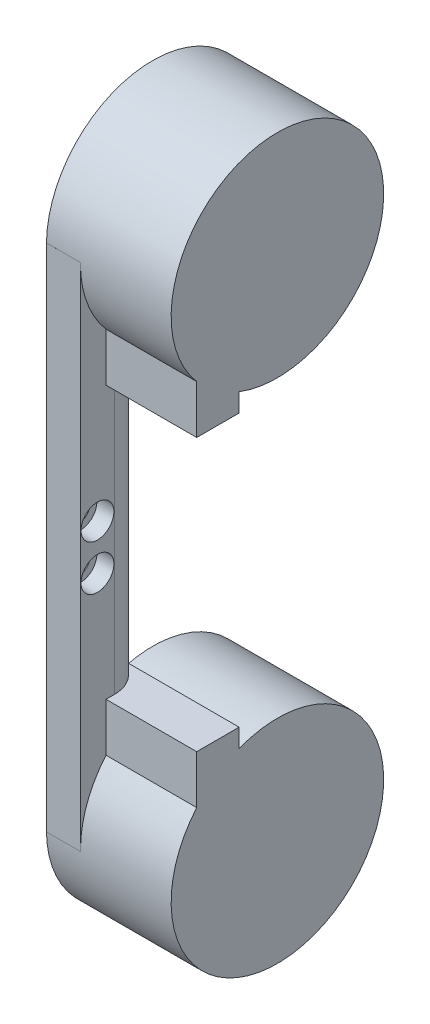
ISO-10303-21;
HEADER;
FILE_DESCRIPTION(('STEP AP214'),'2;1');
FILE_NAME('part.step','',(''),(''),'','','');
FILE_SCHEMA(('AUTOMOTIVE_DESIGN { 1 0 10303 214 1 1 1 1 }'));
ENDSEC;
DATA;
#1=APPLICATION_CONTEXT('core data for automotive mechanical design processes');
#2=APPLICATION_PROTOCOL_DEFINITION('international standard','automotive_design',2000,#1);
#3=PRODUCT_CONTEXT('',#1,'mechanical');
#4=PRODUCT('Part','Part','',(#3));
#5=PRODUCT_RELATED_PRODUCT_CATEGORY('part','',(#4));
#6=PRODUCT_DEFINITION_FORMATION('','',#4);
#7=PRODUCT_DEFINITION_CONTEXT('part definition',#1,'design');
#8=PRODUCT_DEFINITION('design','',#6,#7);
#9=PRODUCT_DEFINITION_SHAPE('','',#8);
#10=(LENGTH_UNIT() NAMED_UNIT(*) SI_UNIT(.MILLI.,.METRE.));
#11=(NAMED_UNIT(*) PLANE_ANGLE_UNIT() SI_UNIT($,.RADIAN.));
#12=(NAMED_UNIT(*) SI_UNIT($,.STERADIAN.) SOLID_ANGLE_UNIT());
#13=UNCERTAINTY_MEASURE_WITH_UNIT(LENGTH_MEASURE(1.E-05),#10,'distance_accuracy_value','');
#14=(GEOMETRIC_REPRESENTATION_CONTEXT(3) GLOBAL_UNCERTAINTY_ASSIGNED_CONTEXT((#13)) GLOBAL_UNIT_ASSIGNED_CONTEXT((#10,
#11,#12)) REPRESENTATION_CONTEXT('',''));
#15=CARTESIAN_POINT('',(0.,0.,0.));
#16=DIRECTION('',(0.,0.,1.));
#17=DIRECTION('',(1.,0.,0.));
#18=AXIS2_PLACEMENT_3D('',#15,#16,#17);
#19=CARTESIAN_POINT('',(0.,0.,0.));
#20=DIRECTION('',(1.,0.,0.));
#21=DIRECTION('',(0.,0.,-1.));
#22=AXIS2_PLACEMENT_3D('',#19,#20,#21);
#23=PLANE('',#22);
#24=CARTESIAN_POINT('',(0.,48.75,15.75));
#25=DIRECTION('',(1.,0.,0.));
#26=DIRECTION('',(0.,0.,1.));
#27=AXIS2_PLACEMENT_3D('',#24,#25,#26);
#28=CIRCLE('',#27,1.6);
#29=CARTESIAN_POINT('',(0.,48.75,17.35));
#30=VERTEX_POINT('',#29);
#31=EDGE_CURVE('E350',#30,#30,#28,.T.);
#32=ORIENTED_EDGE('',*,*,#31,.T.);
#33=EDGE_LOOP('',(#32));
#34=FACE_BOUND('',#33,.T.);
#35=CARTESIAN_POINT('',(0.,40.75,15.75));
#36=DIRECTION('',(-1.,0.,0.));
#37=DIRECTION('',(0.,0.,1.));
#38=AXIS2_PLACEMENT_3D('',#35,#36,#37);
#39=CIRCLE('',#38,1.6);
#40=CARTESIAN_POINT('',(0.,40.75,17.35));
#41=VERTEX_POINT('',#40);
#42=EDGE_CURVE('E471',#41,#41,#39,.T.);
#43=ORIENTED_EDGE('',*,*,#42,.F.);
#44=EDGE_LOOP('',(#43));
#45=FACE_BOUND('',#44,.T.);
#46=DIRECTION('',(0.,0.,-1.));
#47=VECTOR('',#46,1.);
#48=CARTESIAN_POINT('',(0.,49.75,10.25));
#49=LINE('',#48,#47);
#50=CARTESIAN_POINT('',(0.,49.75,7.74999999999999));
#51=VERTEX_POINT('',#50);
#52=CARTESIAN_POINT('',(0.,49.75,6.74999999999999));
#53=VERTEX_POINT('',#52);
#54=EDGE_CURVE('E260',#51,#53,#49,.T.);
#55=ORIENTED_EDGE('',*,*,#54,.F.);
#56=DIRECTION('',(0.,1.,0.));
#57=VECTOR('',#56,1.);
#58=CARTESIAN_POINT('',(0.,8.74999999999999,7.75));
#59=LINE('',#58,#57);
#60=CARTESIAN_POINT('',(0.,70.75,7.74999999999999));
#61=VERTEX_POINT('',#60);
#62=EDGE_CURVE('E463',#51,#61,#59,.T.);
#63=ORIENTED_EDGE('',*,*,#62,.T.);
#64=DIRECTION('',(0.,-1.,0.));
#65=VECTOR('',#64,1.);
#66=CARTESIAN_POINT('',(0.,89.5,7.74999999999998));
#67=LINE('',#66,#65);
#68=CARTESIAN_POINT('',(0.,72.4259459296644,7.74999999999998));
#69=VERTEX_POINT('',#68);
#70=EDGE_CURVE('E340',#69,#61,#67,.T.);
#71=ORIENTED_EDGE('',*,*,#70,.F.);
#72=DIRECTION('',(0.,-1.,0.));
#73=VECTOR('',#72,1.);
#74=CARTESIAN_POINT('',(0.,89.5,7.74999999999998));
#75=LINE('',#74,#73);
#76=CARTESIAN_POINT('',(0.,73.5312805773287,7.74999999999998));
#77=VERTEX_POINT('',#76);
#78=EDGE_CURVE('E346',#77,#69,#75,.T.);
#79=ORIENTED_EDGE('',*,*,#78,.F.);
#80=CARTESIAN_POINT('',(0.,89.5,0.));
#81=DIRECTION('',(-1.,0.,0.));
#82=DIRECTION('',(0.,0.,-1.));
#83=AXIS2_PLACEMENT_3D('',#80,#81,#82);
#84=CIRCLE('',#83,17.75);
#85=CARTESIAN_POINT('',(0.,77.1509109647716,12.75));
#86=VERTEX_POINT('',#85);
#87=EDGE_CURVE('E554',#86,#77,#84,.T.);
#88=ORIENTED_EDGE('',*,*,#87,.F.);
#89=DIRECTION('',(0.,-1.,0.));
#90=VECTOR('',#89,1.);
#91=CARTESIAN_POINT('',(0.,80.75,12.75));
#92=LINE('',#91,#90);
#93=CARTESIAN_POINT('',(0.,70.75,12.75));
#94=VERTEX_POINT('',#93);
#95=EDGE_CURVE('E335',#94,#86,#92,.F.);
#96=ORIENTED_EDGE('',*,*,#95,.F.);
#97=DIRECTION('',(0.,1.,0.));
#98=VECTOR('',#97,1.);
#99=CARTESIAN_POINT('',(0.,8.74999999999999,12.75));
#100=LINE('',#99,#98);
#101=CARTESIAN_POINT('',(0.,18.75,12.75));
#102=VERTEX_POINT('',#101);
#103=EDGE_CURVE('E465',#94,#102,#100,.F.);
#104=ORIENTED_EDGE('',*,*,#103,.T.);
#105=CARTESIAN_POINT('',(0.,12.3490890352285,12.75));
#106=VERTEX_POINT('',#105);
#107=EDGE_CURVE('E466',#102,#106,#100,.F.);
#108=ORIENTED_EDGE('',*,*,#107,.T.);
#109=CARTESIAN_POINT('',(0.,0.,0.));
#110=DIRECTION('',(1.,0.,0.));
#111=DIRECTION('',(0.,0.,-1.));
#112=AXIS2_PLACEMENT_3D('',#109,#110,#111);
#113=CIRCLE('',#112,17.75);
#114=CARTESIAN_POINT('',(0.,15.9687194226713,7.75));
#115=VERTEX_POINT('',#114);
#116=EDGE_CURVE('E632',#106,#115,#113,.T.);
#117=ORIENTED_EDGE('',*,*,#116,.T.);
#118=DIRECTION('',(0.,1.,0.));
#119=VECTOR('',#118,1.);
#120=CARTESIAN_POINT('',(0.,0.,7.75));
#121=LINE('',#120,#119);
#122=CARTESIAN_POINT('',(0.,17.0740540703356,7.75));
#123=VERTEX_POINT('',#122);
#124=EDGE_CURVE('E475',#115,#123,#121,.T.);
#125=ORIENTED_EDGE('',*,*,#124,.T.);
#126=DIRECTION('',(0.,1.,0.));
#127=VECTOR('',#126,1.);
#128=CARTESIAN_POINT('',(0.,0.,7.75));
#129=LINE('',#128,#127);
#130=CARTESIAN_POINT('',(0.,18.75,7.75));
#131=VERTEX_POINT('',#130);
#132=EDGE_CURVE('E516',#123,#131,#129,.T.);
#133=ORIENTED_EDGE('',*,*,#132,.T.);
#134=CARTESIAN_POINT('',(0.,39.75,7.74999999999999));
#135=VERTEX_POINT('',#134);
#136=EDGE_CURVE('E518',#131,#135,#59,.T.);
#137=ORIENTED_EDGE('',*,*,#136,.T.);
#138=DIRECTION('',(0.,0.,1.));
#139=VECTOR('',#138,1.);
#140=CARTESIAN_POINT('',(0.,39.75,10.25));
#141=LINE('',#140,#139);
#142=CARTESIAN_POINT('',(0.,39.75,6.74999999999999));
#143=VERTEX_POINT('',#142);
#144=EDGE_CURVE('E241',#143,#135,#141,.T.);
#145=ORIENTED_EDGE('',*,*,#144,.F.);
#146=DIRECTION('',(0.,1.,0.));
#147=VECTOR('',#146,1.);
#148=CARTESIAN_POINT('',(0.,-0.250000000000007,6.75));
#149=LINE('',#148,#147);
#150=CARTESIAN_POINT('',(0.,20.75,6.75));
#151=VERTEX_POINT('',#150);
#152=EDGE_CURVE('E497',#151,#143,#149,.T.);
#153=ORIENTED_EDGE('',*,*,#152,.F.);
#154=CARTESIAN_POINT('',(0.,17.4928556845359,6.75));
#155=VERTEX_POINT('',#154);
#156=EDGE_CURVE('E500',#155,#151,#149,.T.);
#157=ORIENTED_EDGE('',*,*,#156,.F.);
#158=CARTESIAN_POINT('',(0.,0.,0.));
#159=DIRECTION('',(1.,0.,0.));
#160=DIRECTION('',(0.,0.,-1.));
#161=AXIS2_PLACEMENT_3D('',#158,#159,#160);
#162=CIRCLE('',#161,18.75);
#163=CARTESIAN_POINT('',(0.,-0.250000000000002,18.7483332592527));
#164=VERTEX_POINT('',#163);
#165=EDGE_CURVE('E633',#164,#155,#162,.T.);
#166=ORIENTED_EDGE('',*,*,#165,.F.);
#167=DIRECTION('',(0.,0.,1.));
#168=VECTOR('',#167,1.);
#169=CARTESIAN_POINT('',(0.,-0.250000000000004,18.75));
#170=LINE('',#169,#168);
#171=CARTESIAN_POINT('',(0.,-0.250000000000004,18.75));
#172=VERTEX_POINT('',#171);
#173=EDGE_CURVE('E477',#164,#172,#170,.T.);
#174=ORIENTED_EDGE('',*,*,#173,.T.);
#175=DIRECTION('',(0.,1.,0.));
#176=VECTOR('',#175,1.);
#177=CARTESIAN_POINT('',(0.,-0.250000000000004,18.75));
#178=LINE('',#177,#176);
#179=CARTESIAN_POINT('',(0.,89.75,18.75));
#180=VERTEX_POINT('',#179);
#181=EDGE_CURVE('E494',#172,#180,#178,.T.);
#182=ORIENTED_EDGE('',*,*,#181,.T.);
#183=DIRECTION('',(0.,0.,1.));
#184=VECTOR('',#183,1.);
#185=CARTESIAN_POINT('',(0.,89.75,18.75));
#186=LINE('',#185,#184);
#187=CARTESIAN_POINT('',(0.,89.75,18.7483332592527));
#188=VERTEX_POINT('',#187);
#189=EDGE_CURVE('E349',#188,#180,#186,.T.);
#190=ORIENTED_EDGE('',*,*,#189,.F.);
#191=CARTESIAN_POINT('',(0.,89.5,0.));
#192=DIRECTION('',(-1.,0.,0.));
#193=DIRECTION('',(0.,0.,-1.));
#194=AXIS2_PLACEMENT_3D('',#191,#192,#193);
#195=CIRCLE('',#194,18.75);
#196=CARTESIAN_POINT('',(0.,72.0071443154641,6.74999999999999));
#197=VERTEX_POINT('',#196);
#198=EDGE_CURVE('E549',#188,#197,#195,.T.);
#199=ORIENTED_EDGE('',*,*,#198,.T.);
#200=DIRECTION('',(0.,-1.,0.));
#201=VECTOR('',#200,1.);
#202=CARTESIAN_POINT('',(0.,89.75,6.74999999999998));
#203=LINE('',#202,#201);
#204=CARTESIAN_POINT('',(0.,68.75,6.74999999999999));
#205=VERTEX_POINT('',#204);
#206=EDGE_CURVE('E359',#197,#205,#203,.T.);
#207=ORIENTED_EDGE('',*,*,#206,.T.);
#208=EDGE_CURVE('E490',#53,#205,#149,.T.);
#209=ORIENTED_EDGE('',*,*,#208,.F.);
#210=EDGE_LOOP('',(#55,#63,#71,#79,#88,#96,#104,#108,#117,#125,#133,#137,#145,#153,#157,#166,
#174,#182,#190,#199,#207,#209));
#211=FACE_BOUND('',#210,.T.);
#212=ADVANCED_FACE('F39',(#34,#45,#211),#23,.F.);
#213=CARTESIAN_POINT('',(0.,10.75,12.75));
#214=DIRECTION('',(0.,0.,1.));
#215=DIRECTION('',(0.,-1.,0.));
#216=AXIS2_PLACEMENT_3D('',#213,#214,#215);
#217=PLANE('',#216);
#218=DIRECTION('',(1.,0.,0.));
#219=VECTOR('',#218,1.);
#220=CARTESIAN_POINT('',(0.,18.75,12.75));
#221=LINE('',#220,#219);
#222=CARTESIAN_POINT('',(20.,18.75,12.75));
#223=VERTEX_POINT('',#222);
#224=EDGE_CURVE('E411',#102,#223,#221,.T.);
#225=ORIENTED_EDGE('',*,*,#224,.T.);
#226=DIRECTION('',(0.,1.,0.));
#227=VECTOR('',#226,1.);
#228=CARTESIAN_POINT('',(20.,10.75,12.75));
#229=LINE('',#228,#227);
#230=CARTESIAN_POINT('',(20.,12.3490890352285,12.75));
#231=VERTEX_POINT('',#230);
#232=EDGE_CURVE('E451',#231,#223,#229,.T.);
#233=ORIENTED_EDGE('',*,*,#232,.F.);
#234=DIRECTION('',(-1.,0.,0.));
#235=VECTOR('',#234,1.);
#236=CARTESIAN_POINT('',(20.,12.3490890352285,12.75));
#237=LINE('',#236,#235);
#238=EDGE_CURVE('E456',#231,#106,#237,.T.);
#239=ORIENTED_EDGE('',*,*,#238,.T.);
#240=ORIENTED_EDGE('',*,*,#107,.F.);
#241=EDGE_LOOP('',(#225,#233,#239,#240));
#242=FACE_BOUND('',#241,.T.);
#243=ADVANCED_FACE('F658',(#242),#217,.F.);
#244=CARTESIAN_POINT('',(0.,18.75,0.));
#245=DIRECTION('',(0.,-1.,0.));
#246=DIRECTION('',(0.,0.,-1.));
#247=AXIS2_PLACEMENT_3D('',#244,#245,#246);
#248=PLANE('',#247);
#249=DIRECTION('',(1.,0.,0.));
#250=VECTOR('',#249,1.);
#251=CARTESIAN_POINT('',(0.,18.75,7.75));
#252=LINE('',#251,#250);
#253=CARTESIAN_POINT('',(3.3166247903554,18.75,7.75));
#254=VERTEX_POINT('',#253);
#255=CARTESIAN_POINT('',(20.,18.75,7.75));
#256=VERTEX_POINT('',#255);
#257=EDGE_CURVE('E401',#254,#256,#252,.T.);
#258=ORIENTED_EDGE('',*,*,#257,.T.);
#259=DIRECTION('',(0.,0.,1.));
#260=VECTOR('',#259,1.);
#261=CARTESIAN_POINT('',(20.,18.75,0.));
#262=LINE('',#261,#260);
#263=EDGE_CURVE('E62',#256,#223,#262,.T.);
#264=ORIENTED_EDGE('',*,*,#263,.T.);
#265=ORIENTED_EDGE('',*,*,#224,.F.);
#266=CARTESIAN_POINT('',(0.,18.75,10.25));
#267=DIRECTION('',(0.,-1.,0.));
#268=DIRECTION('',(0.,0.,-1.));
#269=AXIS2_PLACEMENT_3D('',#266,#267,#268);
#270=CIRCLE('',#269,2.5);
#271=EDGE_CURVE('E627',#102,#131,#270,.F.);
#272=ORIENTED_EDGE('',*,*,#271,.T.);
#273=DIRECTION('',(-1.,0.,0.));
#274=VECTOR('',#273,1.);
#275=CARTESIAN_POINT('',(0.,18.75,7.75));
#276=LINE('',#275,#274);
#277=EDGE_CURVE('E455',#254,#131,#276,.T.);
#278=ORIENTED_EDGE('',*,*,#277,.F.);
#279=EDGE_LOOP('',(#258,#264,#265,#272,#278));
#280=FACE_BOUND('',#279,.T.);
#281=ADVANCED_FACE('F431',(#280),#248,.T.);
#282=CARTESIAN_POINT('',(0.,17.0747370752051,7.74698998402707));
#283=DIRECTION('',(0.,-0.00179673952654987,0.999998385862234));
#284=DIRECTION('',(0.,-0.999998385862234,-0.00179673952654987));
#285=AXIS2_PLACEMENT_3D('',#282,#283,#284);
#286=PLANE('',#285);
#287=CARTESIAN_POINT('',(3.31435366731395,17.0747370752051,7.74698998402707));
#288=DIRECTION('',(1.,0.,0.));
#289=VECTOR('',#288,1.);
#290=LINE('',#287,#289);
#291=CARTESIAN_POINT('',(3.31470459409763,17.0745260057656,7.74745508222076));
#292=VERTEX_POINT('',#291);
#293=CARTESIAN_POINT('',(20.,17.0738840041313,7.74849468643625));
#294=VERTEX_POINT('',#293);
#295=EDGE_CURVE('E636',#292,#294,#290,.T.);
#296=ORIENTED_EDGE('',*,*,#295,.T.);
#297=DIRECTION('',(0.,0.999998385862234,0.00179673952654987));
#298=VECTOR('',#297,1.);
#299=CARTESIAN_POINT('',(20.,17.0747370752051,7.74698998402707));
#300=LINE('',#299,#298);
#301=EDGE_CURVE('E525',#294,#256,#300,.T.);
#302=ORIENTED_EDGE('',*,*,#301,.T.);
#303=ORIENTED_EDGE('',*,*,#257,.F.);
#304=CARTESIAN_POINT('',(3.3166247903554,17.0733710789639,7.75));
#305=DIRECTION('',(0.,1.,0.));
#306=VECTOR('',#305,1.);
#307=LINE('',#304,#306);
#308=EDGE_CURVE('E462',#292,#254,#307,.T.);
#309=ORIENTED_EDGE('',*,*,#308,.F.);
#310=EDGE_LOOP('',(#296,#302,#303,#309));
#311=FACE_BOUND('',#310,.T.);
#312=ADVANCED_FACE('F423',(#311),#286,.T.);
#313=CARTESIAN_POINT('',(6.,-0.250000000000004,12.75));
#314=DIRECTION('',(1.,0.,0.));
#315=DIRECTION('',(0.,0.,-1.));
#316=AXIS2_PLACEMENT_3D('',#313,#314,#315);
#317=PLANE('',#316);
#318=CARTESIAN_POINT('',(6.,40.75,15.75));
#319=DIRECTION('',(1.,0.,0.));
#320=DIRECTION('',(0.,0.,-1.));
#321=AXIS2_PLACEMENT_3D('',#318,#319,#320);
#322=CIRCLE('',#321,2.9);
#323=CARTESIAN_POINT('',(6.,40.75,12.85));
#324=VERTEX_POINT('',#323);
#325=EDGE_CURVE('E473',#324,#324,#322,.T.);
#326=ORIENTED_EDGE('',*,*,#325,.F.);
#327=EDGE_LOOP('',(#326));
#328=FACE_BOUND('',#327,.T.);
#329=DIRECTION('',(0.,-1.,0.));
#330=VECTOR('',#329,1.);
#331=CARTESIAN_POINT('',(6.,-0.250000000000004,14.2370280871371));
#332=LINE('',#331,#330);
#333=CARTESIAN_POINT('',(6.,20.75,14.2370280871371));
#334=VERTEX_POINT('',#333);
#335=CARTESIAN_POINT('',(6.,12.2012102369425,14.2370280871371));
#336=VERTEX_POINT('',#335);
#337=EDGE_CURVE('E511',#334,#336,#332,.T.);
#338=ORIENTED_EDGE('',*,*,#337,.F.);
#339=DIRECTION('',(0.,0.,1.));
#340=VECTOR('',#339,1.);
#341=CARTESIAN_POINT('',(6.,20.75,12.75));
#342=LINE('',#341,#340);
#343=CARTESIAN_POINT('',(6.,20.75,12.75));
#344=VERTEX_POINT('',#343);
#345=EDGE_CURVE('E523',#344,#334,#342,.T.);
#346=ORIENTED_EDGE('',*,*,#345,.F.);
#347=DIRECTION('',(0.,1.,0.));
#348=VECTOR('',#347,1.);
#349=CARTESIAN_POINT('',(6.,-0.250000000000004,12.75));
#350=LINE('',#349,#348);
#351=CARTESIAN_POINT('',(6.,68.75,12.75));
#352=VERTEX_POINT('',#351);
#353=EDGE_CURVE('E486',#344,#352,#350,.T.);
#354=ORIENTED_EDGE('',*,*,#353,.T.);
#355=DIRECTION('',(0.,0.,1.));
#356=VECTOR('',#355,1.);
#357=CARTESIAN_POINT('',(6.,68.75,12.75));
#358=LINE('',#357,#356);
#359=CARTESIAN_POINT('',(6.,68.75,14.2370280871371));
#360=VERTEX_POINT('',#359);
#361=EDGE_CURVE('E383',#352,#360,#358,.T.);
#362=ORIENTED_EDGE('',*,*,#361,.T.);
#363=DIRECTION('',(0.,1.,0.));
#364=VECTOR('',#363,1.);
#365=CARTESIAN_POINT('',(6.,89.75,14.2370280871371));
#366=LINE('',#365,#364);
#367=CARTESIAN_POINT('',(6.,77.2987897630575,14.2370280871371));
#368=VERTEX_POINT('',#367);
#369=EDGE_CURVE('E376',#360,#368,#366,.T.);
#370=ORIENTED_EDGE('',*,*,#369,.T.);
#371=CARTESIAN_POINT('',(6.,89.5,0.));
#372=DIRECTION('',(-1.,0.,0.));
#373=DIRECTION('',(0.,0.,-1.));
#374=AXIS2_PLACEMENT_3D('',#371,#372,#373);
#375=CIRCLE('',#374,18.75);
#376=CARTESIAN_POINT('',(6.,89.5,18.75));
#377=VERTEX_POINT('',#376);
#378=EDGE_CURVE('E369',#368,#377,#375,.T.);
#379=ORIENTED_EDGE('',*,*,#378,.T.);
#380=DIRECTION('',(0.,1.,0.));
#381=VECTOR('',#380,1.);
#382=CARTESIAN_POINT('',(6.,-0.250000000000004,18.75));
#383=LINE('',#382,#381);
#384=CARTESIAN_POINT('',(6.,0.,18.75));
#385=VERTEX_POINT('',#384);
#386=EDGE_CURVE('E492',#385,#377,#383,.T.);
#387=ORIENTED_EDGE('',*,*,#386,.F.);
#388=CARTESIAN_POINT('',(6.,0.,0.));
#389=DIRECTION('',(1.,0.,0.));
#390=DIRECTION('',(0.,0.,-1.));
#391=AXIS2_PLACEMENT_3D('',#388,#389,#390);
#392=CIRCLE('',#391,18.75);
#393=EDGE_CURVE('E503',#336,#385,#392,.T.);
#394=ORIENTED_EDGE('',*,*,#393,.F.);
#395=EDGE_LOOP('',(#338,#346,#354,#362,#370,#379,#387,#394));
#396=FACE_BOUND('',#395,.T.);
#397=CARTESIAN_POINT('',(6.,48.75,15.75));
#398=DIRECTION('',(-1.,0.,0.));
#399=DIRECTION('',(0.,0.,-1.));
#400=AXIS2_PLACEMENT_3D('',#397,#398,#399);
#401=CIRCLE('',#400,2.9);
#402=CARTESIAN_POINT('',(6.,48.75,12.85));
#403=VERTEX_POINT('',#402);
#404=EDGE_CURVE('E343',#403,#403,#401,.T.);
#405=ORIENTED_EDGE('',*,*,#404,.T.);
#406=EDGE_LOOP('',(#405));
#407=FACE_BOUND('',#406,.T.);
#408=ADVANCED_FACE('F434',(#328,#396,#407),#317,.T.);
#409=CARTESIAN_POINT('',(20.,0.,0.));
#410=DIRECTION('',(-1.,0.,0.));
#411=DIRECTION('',(0.,0.,1.));
#412=AXIS2_PLACEMENT_3D('',#409,#410,#411);
#413=CYLINDRICAL_SURFACE('',#412,18.75);
#414=DIRECTION('',(1.,0.,0.));
#415=VECTOR('',#414,1.);
#416=CARTESIAN_POINT('',(0.,12.2012102369425,14.2370280871371));
#417=LINE('',#416,#415);
#418=CARTESIAN_POINT('',(22.,12.2012102369425,14.2370280871371));
#419=VERTEX_POINT('',#418);
#420=EDGE_CURVE('E410',#336,#419,#417,.T.);
#421=ORIENTED_EDGE('',*,*,#420,.F.);
#422=ORIENTED_EDGE('',*,*,#393,.T.);
#423=CARTESIAN_POINT('',(6.,-0.250000000000004,18.7483332592527));
#424=VERTEX_POINT('',#423);
#425=EDGE_CURVE('E505',#385,#424,#392,.T.);
#426=ORIENTED_EDGE('',*,*,#425,.T.);
#427=DIRECTION('',(-1.,0.,0.));
#428=VECTOR('',#427,1.);
#429=CARTESIAN_POINT('',(20.,-0.250000000000002,18.7483332592527));
#430=LINE('',#429,#428);
#431=EDGE_CURVE('E487',#164,#424,#430,.F.);
#432=ORIENTED_EDGE('',*,*,#431,.F.);
#433=ORIENTED_EDGE('',*,*,#165,.T.);
#434=DIRECTION('',(1.,0.,0.));
#435=VECTOR('',#434,1.);
#436=CARTESIAN_POINT('',(0.,17.4928556845359,6.75));
#437=LINE('',#436,#435);
#438=CARTESIAN_POINT('',(22.,17.4928556845359,6.75));
#439=VERTEX_POINT('',#438);
#440=EDGE_CURVE('E414',#155,#439,#437,.T.);
#441=ORIENTED_EDGE('',*,*,#440,.T.);
#442=CARTESIAN_POINT('',(22.,0.,0.));
#443=DIRECTION('',(1.,0.,0.));
#444=DIRECTION('',(0.,0.,-1.));
#445=AXIS2_PLACEMENT_3D('',#442,#443,#444);
#446=CIRCLE('',#445,18.75);
#447=EDGE_CURVE('E508',#419,#439,#446,.T.);
#448=ORIENTED_EDGE('',*,*,#447,.F.);
#449=EDGE_LOOP('',(#421,#422,#426,#432,#433,#441,#448));
#450=FACE_BOUND('',#449,.T.);
#451=ADVANCED_FACE('F41',(#450),#413,.T.);
#452=CARTESIAN_POINT('',(0.,8.74999999999999,10.25));
#453=DIRECTION('',(0.,1.,0.));
#454=DIRECTION('',(0.,0.,1.));
#455=AXIS2_PLACEMENT_3D('',#452,#453,#454);
#456=CYLINDRICAL_SURFACE('',#455,2.5);
#457=ORIENTED_EDGE('',*,*,#62,.F.);
#458=CARTESIAN_POINT('',(0.,49.75,10.25));
#459=DIRECTION('',(0.,1.,0.));
#460=DIRECTION('',(0.,0.,1.));
#461=AXIS2_PLACEMENT_3D('',#458,#459,#460);
#462=CIRCLE('',#461,2.5);
#463=CARTESIAN_POINT('',(2.5,49.75,10.25));
#464=VERTEX_POINT('',#463);
#465=EDGE_CURVE('E248',#51,#464,#462,.F.);
#466=ORIENTED_EDGE('',*,*,#465,.T.);
#467=DIRECTION('',(0.,1.,0.));
#468=VECTOR('',#467,1.);
#469=CARTESIAN_POINT('',(2.5,49.75,10.25));
#470=LINE('',#469,#468);
#471=CARTESIAN_POINT('',(2.5,39.75,10.25));
#472=VERTEX_POINT('',#471);
#473=EDGE_CURVE('E249',#472,#464,#470,.T.);
#474=ORIENTED_EDGE('',*,*,#473,.F.);
#475=CARTESIAN_POINT('',(0.,39.75,10.25));
#476=DIRECTION('',(0.,-1.,0.));
#477=DIRECTION('',(0.,0.,-1.));
#478=AXIS2_PLACEMENT_3D('',#475,#476,#477);
#479=CIRCLE('',#478,2.5);
#480=EDGE_CURVE('E233',#472,#135,#479,.F.);
#481=ORIENTED_EDGE('',*,*,#480,.T.);
#482=ORIENTED_EDGE('',*,*,#136,.F.);
#483=ORIENTED_EDGE('',*,*,#271,.F.);
#484=ORIENTED_EDGE('',*,*,#103,.F.);
#485=CARTESIAN_POINT('',(0.,70.75,10.25));
#486=DIRECTION('',(0.,-1.,0.));
#487=DIRECTION('',(0.,0.,-1.));
#488=AXIS2_PLACEMENT_3D('',#485,#486,#487);
#489=CIRCLE('',#488,2.5);
#490=EDGE_CURVE('E553',#94,#61,#489,.F.);
#491=ORIENTED_EDGE('',*,*,#490,.T.);
#492=EDGE_LOOP('',(#457,#466,#474,#481,#482,#483,#484,#491));
#493=FACE_BOUND('',#492,.T.);
#494=ADVANCED_FACE('F251',(#493),#456,.F.);
#495=CARTESIAN_POINT('',(22.,40.75,15.75));
#496=DIRECTION('',(-1.,0.,0.));
#497=DIRECTION('',(0.,0.,1.));
#498=AXIS2_PLACEMENT_3D('',#495,#496,#497);
#499=CYLINDRICAL_SURFACE('',#498,1.6);
#500=ORIENTED_EDGE('',*,*,#42,.T.);
#501=EDGE_LOOP('',(#500));
#502=FACE_BOUND('',#501,.T.);
#503=CARTESIAN_POINT('',(3.,40.75,15.75));
#504=DIRECTION('',(1.,0.,0.));
#505=DIRECTION('',(0.,0.,-1.));
#506=AXIS2_PLACEMENT_3D('',#503,#504,#505);
#507=CIRCLE('',#506,1.6);
#508=CARTESIAN_POINT('',(3.,40.75,14.15));
#509=VERTEX_POINT('',#508);
#510=EDGE_CURVE('E469',#509,#509,#507,.F.);
#511=ORIENTED_EDGE('',*,*,#510,.F.);
#512=EDGE_LOOP('',(#511));
#513=FACE_BOUND('',#512,.T.);
#514=ADVANCED_FACE('F703',(#502,#513),#499,.F.);
#515=CARTESIAN_POINT('',(20.,0.,0.));
#516=DIRECTION('',(-1.,0.,0.));
#517=DIRECTION('',(0.,0.,1.));
#518=AXIS2_PLACEMENT_3D('',#515,#516,#517);
#519=CYLINDRICAL_SURFACE('',#518,17.75);
#520=DIRECTION('',(-1.,0.,0.));
#521=VECTOR('',#520,1.);
#522=CARTESIAN_POINT('',(20.,15.9687194226713,7.75));
#523=LINE('',#522,#521);
#524=CARTESIAN_POINT('',(20.,15.9687194226713,7.75));
#525=VERTEX_POINT('',#524);
#526=EDGE_CURVE('E634',#115,#525,#523,.F.);
#527=ORIENTED_EDGE('',*,*,#526,.F.);
#528=ORIENTED_EDGE('',*,*,#116,.F.);
#529=ORIENTED_EDGE('',*,*,#238,.F.);
#530=CARTESIAN_POINT('',(20.,0.,0.));
#531=DIRECTION('',(1.,0.,0.));
#532=DIRECTION('',(0.,0.,-1.));
#533=AXIS2_PLACEMENT_3D('',#530,#531,#532);
#534=CIRCLE('',#533,17.75);
#535=EDGE_CURVE('E510',#231,#525,#534,.T.);
#536=ORIENTED_EDGE('',*,*,#535,.T.);
#537=EDGE_LOOP('',(#527,#528,#529,#536));
#538=FACE_BOUND('',#537,.T.);
#539=ADVANCED_FACE('F686',(#538),#519,.F.);
#540=CARTESIAN_POINT('',(20.,0.,0.));
#541=DIRECTION('',(1.,0.,0.));
#542=DIRECTION('',(0.,0.,-1.));
#543=AXIS2_PLACEMENT_3D('',#540,#541,#542);
#544=PLANE('',#543);
#545=ORIENTED_EDGE('',*,*,#232,.T.);
#546=ORIENTED_EDGE('',*,*,#263,.F.);
#547=ORIENTED_EDGE('',*,*,#301,.F.);
#548=DIRECTION('',(0.,1.,0.));
#549=VECTOR('',#548,1.);
#550=CARTESIAN_POINT('',(20.,10.75,7.75));
#551=LINE('',#550,#549);
#552=EDGE_CURVE('E460',#525,#294,#551,.T.);
#553=ORIENTED_EDGE('',*,*,#552,.F.);
#554=ORIENTED_EDGE('',*,*,#535,.F.);
#555=EDGE_LOOP('',(#545,#546,#547,#553,#554));
#556=FACE_BOUND('',#555,.T.);
#557=ADVANCED_FACE('F688',(#556),#544,.F.);
#558=CARTESIAN_POINT('',(22.,0.,0.));
#559=DIRECTION('',(1.,0.,0.));
#560=DIRECTION('',(0.,0.,-1.));
#561=AXIS2_PLACEMENT_3D('',#558,#559,#560);
#562=PLANE('',#561);
#563=ORIENTED_EDGE('',*,*,#447,.T.);
#564=DIRECTION('',(0.,1.,0.));
#565=VECTOR('',#564,1.);
#566=CARTESIAN_POINT('',(22.,17.4928556845359,6.75));
#567=LINE('',#566,#565);
#568=CARTESIAN_POINT('',(22.,20.75,6.74999999999999));
#569=VERTEX_POINT('',#568);
#570=EDGE_CURVE('E409',#439,#569,#567,.T.);
#571=ORIENTED_EDGE('',*,*,#570,.T.);
#572=DIRECTION('',(0.,0.,-1.));
#573=VECTOR('',#572,1.);
#574=CARTESIAN_POINT('',(22.,20.75,14.2370280871371));
#575=LINE('',#574,#573);
#576=CARTESIAN_POINT('',(22.,20.75,14.2370280871371));
#577=VERTEX_POINT('',#576);
#578=EDGE_CURVE('E393',#577,#569,#575,.T.);
#579=ORIENTED_EDGE('',*,*,#578,.F.);
#580=DIRECTION('',(0.,-1.,0.));
#581=VECTOR('',#580,1.);
#582=CARTESIAN_POINT('',(22.,12.2012102369425,14.2370280871371));
#583=LINE('',#582,#581);
#584=EDGE_CURVE('E408',#577,#419,#583,.T.);
#585=ORIENTED_EDGE('',*,*,#584,.T.);
#586=EDGE_LOOP('',(#563,#571,#579,#585));
#587=FACE_BOUND('',#586,.T.);
#588=ADVANCED_FACE('F695',(#587),#562,.T.);
#589=CARTESIAN_POINT('',(6.,-0.250000000000004,18.75));
#590=DIRECTION('',(0.,0.,1.));
#591=DIRECTION('',(1.,0.,0.));
#592=AXIS2_PLACEMENT_3D('',#589,#590,#591);
#593=PLANE('',#592);
#594=ORIENTED_EDGE('',*,*,#181,.F.);
#595=DIRECTION('',(1.,0.,0.));
#596=VECTOR('',#595,1.);
#597=CARTESIAN_POINT('',(6.,-0.250000000000004,18.75));
#598=LINE('',#597,#596);
#599=CARTESIAN_POINT('',(6.,-0.250000000000004,18.75));
#600=VERTEX_POINT('',#599);
#601=EDGE_CURVE('E483',#172,#600,#598,.T.);
#602=ORIENTED_EDGE('',*,*,#601,.T.);
#603=EDGE_CURVE('E491',#600,#385,#383,.T.);
#604=ORIENTED_EDGE('',*,*,#603,.T.);
#605=ORIENTED_EDGE('',*,*,#386,.T.);
#606=DIRECTION('',(0.,-1.,0.));
#607=VECTOR('',#606,1.);
#608=CARTESIAN_POINT('',(6.,89.75,18.75));
#609=LINE('',#608,#607);
#610=CARTESIAN_POINT('',(6.,89.75,18.75));
#611=VERTEX_POINT('',#610);
#612=EDGE_CURVE('E356',#611,#377,#609,.T.);
#613=ORIENTED_EDGE('',*,*,#612,.F.);
#614=DIRECTION('',(1.,0.,0.));
#615=VECTOR('',#614,1.);
#616=CARTESIAN_POINT('',(6.,89.75,18.75));
#617=LINE('',#616,#615);
#618=EDGE_CURVE('E352',#180,#611,#617,.T.);
#619=ORIENTED_EDGE('',*,*,#618,.F.);
#620=EDGE_LOOP('',(#594,#602,#604,#605,#613,#619));
#621=FACE_BOUND('',#620,.T.);
#622=ADVANCED_FACE('F697',(#621),#593,.T.);
#623=CARTESIAN_POINT('',(0.,-0.250000000000004,12.75));
#624=DIRECTION('',(0.,1.,0.));
#625=DIRECTION('',(0.,0.,1.));
#626=AXIS2_PLACEMENT_3D('',#623,#624,#625);
#627=CYLINDRICAL_SURFACE('',#626,6.);
#628=CARTESIAN_POINT('',(0.,49.75,12.75));
#629=DIRECTION('',(0.,1.,0.));
#630=DIRECTION('',(0.,0.,1.));
#631=AXIS2_PLACEMENT_3D('',#628,#629,#630);
#632=CIRCLE('',#631,6.);
#633=CARTESIAN_POINT('',(2.5,49.75,7.29564394268213));
#634=VERTEX_POINT('',#633);
#635=EDGE_CURVE('E11',#53,#634,#632,.F.);
#636=ORIENTED_EDGE('',*,*,#635,.F.);
#637=ORIENTED_EDGE('',*,*,#208,.T.);
#638=CARTESIAN_POINT('',(0.,68.75,12.75));
#639=DIRECTION('',(0.,-1.,0.));
#640=DIRECTION('',(0.,0.,1.));
#641=AXIS2_PLACEMENT_3D('',#638,#639,#640);
#642=CIRCLE('',#641,6.);
#643=EDGE_CURVE('E271',#205,#352,#642,.T.);
#644=ORIENTED_EDGE('',*,*,#643,.T.);
#645=ORIENTED_EDGE('',*,*,#353,.F.);
#646=CARTESIAN_POINT('',(0.,20.75,12.75));
#647=DIRECTION('',(0.,-1.,0.));
#648=DIRECTION('',(0.,0.,1.));
#649=AXIS2_PLACEMENT_3D('',#646,#647,#648);
#650=CIRCLE('',#649,6.);
#651=EDGE_CURVE('E400',#151,#344,#650,.T.);
#652=ORIENTED_EDGE('',*,*,#651,.F.);
#653=ORIENTED_EDGE('',*,*,#152,.T.);
#654=CARTESIAN_POINT('',(0.,39.75,12.75));
#655=DIRECTION('',(0.,-1.,0.));
#656=DIRECTION('',(0.,0.,-1.));
#657=AXIS2_PLACEMENT_3D('',#654,#655,#656);
#658=CIRCLE('',#657,6.);
#659=CARTESIAN_POINT('',(2.5,39.75,7.29564394268214));
#660=VERTEX_POINT('',#659);
#661=EDGE_CURVE('E50',#660,#143,#658,.F.);
#662=ORIENTED_EDGE('',*,*,#661,.F.);
#663=DIRECTION('',(0.,1.,0.));
#664=VECTOR('',#663,1.);
#665=CARTESIAN_POINT('',(2.5,-0.250000000000005,7.29564394268214));
#666=LINE('',#665,#664);
#667=EDGE_CURVE('E254',#660,#634,#666,.T.);
#668=ORIENTED_EDGE('',*,*,#667,.T.);
#669=EDGE_LOOP('',(#636,#637,#644,#645,#652,#653,#662,#668));
#670=FACE_BOUND('',#669,.T.);
#671=ADVANCED_FACE('F537',(#670),#627,.T.);
#672=CARTESIAN_POINT('',(0.,-0.250000000000004,12.75));
#673=DIRECTION('',(0.,1.,0.));
#674=DIRECTION('',(0.,0.,1.));
#675=AXIS2_PLACEMENT_3D('',#672,#673,#674);
#676=PLANE('',#675);
#677=ORIENTED_EDGE('',*,*,#173,.F.);
#678=ORIENTED_EDGE('',*,*,#431,.T.);
#679=DIRECTION('',(0.,0.,-1.));
#680=VECTOR('',#679,1.);
#681=CARTESIAN_POINT('',(6.,-0.250000000000004,12.75));
#682=LINE('',#681,#680);
#683=EDGE_CURVE('E485',#600,#424,#682,.T.);
#684=ORIENTED_EDGE('',*,*,#683,.F.);
#685=ORIENTED_EDGE('',*,*,#601,.F.);
#686=EDGE_LOOP('',(#677,#678,#684,#685));
#687=FACE_BOUND('',#686,.T.);
#688=ADVANCED_FACE('F786',(#687),#676,.F.);
#689=ORIENTED_EDGE('',*,*,#425,.F.);
#690=ORIENTED_EDGE('',*,*,#603,.F.);
#691=ORIENTED_EDGE('',*,*,#683,.T.);
#692=EDGE_LOOP('',(#689,#690,#691));
#693=FACE_BOUND('',#692,.T.);
#694=ADVANCED_FACE('F772',(#693),#317,.T.);
#695=CARTESIAN_POINT('',(3.,40.75,15.75));
#696=DIRECTION('',(1.,0.,0.));
#697=DIRECTION('',(0.,0.,-1.));
#698=AXIS2_PLACEMENT_3D('',#695,#696,#697);
#699=PLANE('',#698);
#700=CARTESIAN_POINT('',(3.,40.75,15.75));
#701=DIRECTION('',(1.,0.,0.));
#702=DIRECTION('',(0.,0.,-1.));
#703=AXIS2_PLACEMENT_3D('',#700,#701,#702);
#704=CIRCLE('',#703,2.9);
#705=CARTESIAN_POINT('',(3.,40.75,12.85));
#706=VERTEX_POINT('',#705);
#707=EDGE_CURVE('E470',#706,#706,#704,.T.);
#708=ORIENTED_EDGE('',*,*,#707,.T.);
#709=EDGE_LOOP('',(#708));
#710=FACE_BOUND('',#709,.T.);
#711=ORIENTED_EDGE('',*,*,#510,.T.);
#712=EDGE_LOOP('',(#711));
#713=FACE_BOUND('',#712,.T.);
#714=ADVANCED_FACE('F805',(#710,#713),#699,.T.);
#715=CARTESIAN_POINT('',(3.,40.75,15.75));
#716=DIRECTION('',(1.,0.,0.));
#717=DIRECTION('',(0.,0.,-1.));
#718=AXIS2_PLACEMENT_3D('',#715,#716,#717);
#719=CYLINDRICAL_SURFACE('',#718,2.9);
#720=ORIENTED_EDGE('',*,*,#707,.F.);
#721=EDGE_LOOP('',(#720));
#722=FACE_BOUND('',#721,.T.);
#723=ORIENTED_EDGE('',*,*,#325,.T.);
#724=EDGE_LOOP('',(#723));
#725=FACE_BOUND('',#724,.T.);
#726=ADVANCED_FACE('F659',(#722,#725),#719,.F.);
#727=CARTESIAN_POINT('',(0.,10.75,7.75));
#728=DIRECTION('',(0.,0.,-1.));
#729=DIRECTION('',(0.,1.,0.));
#730=AXIS2_PLACEMENT_3D('',#727,#728,#729);
#731=PLANE('',#730);
#732=ORIENTED_EDGE('',*,*,#132,.F.);
#733=ORIENTED_EDGE('',*,*,#124,.F.);
#734=ORIENTED_EDGE('',*,*,#526,.T.);
#735=ORIENTED_EDGE('',*,*,#552,.T.);
#736=ORIENTED_EDGE('',*,*,#295,.F.);
#737=ORIENTED_EDGE('',*,*,#308,.T.);
#738=ORIENTED_EDGE('',*,*,#277,.T.);
#739=EDGE_LOOP('',(#732,#733,#734,#735,#736,#737,#738));
#740=FACE_BOUND('',#739,.T.);
#741=ADVANCED_FACE('F648',(#740),#731,.F.);
#742=CARTESIAN_POINT('',(0.,12.2012102369425,14.2370280871371));
#743=DIRECTION('',(0.,0.,1.));
#744=DIRECTION('',(1.,0.,0.));
#745=AXIS2_PLACEMENT_3D('',#742,#743,#744);
#746=PLANE('',#745);
#747=ORIENTED_EDGE('',*,*,#584,.F.);
#748=DIRECTION('',(1.,0.,0.));
#749=VECTOR('',#748,1.);
#750=CARTESIAN_POINT('',(22.,20.75,14.2370280871371));
#751=LINE('',#750,#749);
#752=EDGE_CURVE('E404',#334,#577,#751,.T.);
#753=ORIENTED_EDGE('',*,*,#752,.F.);
#754=ORIENTED_EDGE('',*,*,#337,.T.);
#755=ORIENTED_EDGE('',*,*,#420,.T.);
#756=EDGE_LOOP('',(#747,#753,#754,#755));
#757=FACE_BOUND('',#756,.T.);
#758=ADVANCED_FACE('F660',(#757),#746,.T.);
#759=CARTESIAN_POINT('',(0.,17.4928556845359,6.75));
#760=DIRECTION('',(0.,0.,-1.));
#761=DIRECTION('',(0.,1.,0.));
#762=AXIS2_PLACEMENT_3D('',#759,#760,#761);
#763=PLANE('',#762);
#764=ORIENTED_EDGE('',*,*,#156,.T.);
#765=DIRECTION('',(-1.,0.,0.));
#766=VECTOR('',#765,1.);
#767=CARTESIAN_POINT('',(22.,20.75,6.74999999999999));
#768=LINE('',#767,#766);
#769=EDGE_CURVE('E398',#569,#151,#768,.T.);
#770=ORIENTED_EDGE('',*,*,#769,.F.);
#771=ORIENTED_EDGE('',*,*,#570,.F.);
#772=ORIENTED_EDGE('',*,*,#440,.F.);
#773=EDGE_LOOP('',(#764,#770,#771,#772));
#774=FACE_BOUND('',#773,.T.);
#775=ADVANCED_FACE('F437',(#774),#763,.T.);
#776=CARTESIAN_POINT('',(0.,20.75,12.75));
#777=DIRECTION('',(0.,1.,0.));
#778=DIRECTION('',(0.,0.,1.));
#779=AXIS2_PLACEMENT_3D('',#776,#777,#778);
#780=PLANE('',#779);
#781=ORIENTED_EDGE('',*,*,#651,.T.);
#782=ORIENTED_EDGE('',*,*,#345,.T.);
#783=ORIENTED_EDGE('',*,*,#752,.T.);
#784=ORIENTED_EDGE('',*,*,#578,.T.);
#785=ORIENTED_EDGE('',*,*,#769,.T.);
#786=EDGE_LOOP('',(#781,#782,#783,#784,#785));
#787=FACE_BOUND('',#786,.T.);
#788=ADVANCED_FACE('F731',(#787),#780,.T.);
#789=CARTESIAN_POINT('',(0.,78.75,12.75));
#790=DIRECTION('',(0.,0.,1.));
#791=DIRECTION('',(0.,1.,0.));
#792=AXIS2_PLACEMENT_3D('',#789,#790,#791);
#793=PLANE('',#792);
#794=DIRECTION('',(1.,0.,0.));
#795=VECTOR('',#794,1.);
#796=CARTESIAN_POINT('',(0.,70.75,12.75));
#797=LINE('',#796,#795);
#798=CARTESIAN_POINT('',(20.,70.75,12.75));
#799=VERTEX_POINT('',#798);
#800=EDGE_CURVE('E284',#94,#799,#797,.T.);
#801=ORIENTED_EDGE('',*,*,#800,.F.);
#802=ORIENTED_EDGE('',*,*,#95,.T.);
#803=DIRECTION('',(-1.,0.,0.));
#804=VECTOR('',#803,1.);
#805=CARTESIAN_POINT('',(20.,77.1509109647716,12.75));
#806=LINE('',#805,#804);
#807=CARTESIAN_POINT('',(20.,77.1509109647716,12.75));
#808=VERTEX_POINT('',#807);
#809=EDGE_CURVE('E326',#808,#86,#806,.T.);
#810=ORIENTED_EDGE('',*,*,#809,.F.);
#811=DIRECTION('',(0.,-1.,0.));
#812=VECTOR('',#811,1.);
#813=CARTESIAN_POINT('',(20.,78.75,12.75));
#814=LINE('',#813,#812);
#815=EDGE_CURVE('E328',#808,#799,#814,.T.);
#816=ORIENTED_EDGE('',*,*,#815,.T.);
#817=EDGE_LOOP('',(#801,#802,#810,#816));
#818=FACE_BOUND('',#817,.T.);
#819=ADVANCED_FACE('F595',(#818),#793,.F.);
#820=CARTESIAN_POINT('',(0.,70.75,0.));
#821=DIRECTION('',(0.,1.,0.));
#822=DIRECTION('',(0.,0.,-1.));
#823=AXIS2_PLACEMENT_3D('',#820,#821,#822);
#824=PLANE('',#823);
#825=DIRECTION('',(1.,0.,0.));
#826=VECTOR('',#825,1.);
#827=CARTESIAN_POINT('',(0.,70.75,7.74999999999998));
#828=LINE('',#827,#826);
#829=CARTESIAN_POINT('',(3.3166247903554,70.75,7.74999999999998));
#830=VERTEX_POINT('',#829);
#831=CARTESIAN_POINT('',(20.,70.75,7.74999999999998));
#832=VERTEX_POINT('',#831);
#833=EDGE_CURVE('E276',#830,#832,#828,.T.);
#834=ORIENTED_EDGE('',*,*,#833,.F.);
#835=DIRECTION('',(-1.,0.,0.));
#836=VECTOR('',#835,1.);
#837=CARTESIAN_POINT('',(0.,70.75,7.74999999999998));
#838=LINE('',#837,#836);
#839=EDGE_CURVE('E321',#830,#61,#838,.T.);
#840=ORIENTED_EDGE('',*,*,#839,.T.);
#841=ORIENTED_EDGE('',*,*,#490,.F.);
#842=ORIENTED_EDGE('',*,*,#800,.T.);
#843=DIRECTION('',(0.,0.,1.));
#844=VECTOR('',#843,1.);
#845=CARTESIAN_POINT('',(20.,70.75,0.));
#846=LINE('',#845,#844);
#847=EDGE_CURVE('E261',#832,#799,#846,.T.);
#848=ORIENTED_EDGE('',*,*,#847,.F.);
#849=EDGE_LOOP('',(#834,#840,#841,#842,#848));
#850=FACE_BOUND('',#849,.T.);
#851=ADVANCED_FACE('F307',(#850),#824,.T.);
#852=CARTESIAN_POINT('',(0.,72.4252629247949,7.74698998402706));
#853=DIRECTION('',(0.,0.00179673952655032,0.999998385862234));
#854=DIRECTION('',(0.,0.999998385862234,-0.00179673952655032));
#855=AXIS2_PLACEMENT_3D('',#852,#853,#854);
#856=PLANE('',#855);
#857=CARTESIAN_POINT('',(3.3166247903554,72.4266289210361,7.74999999999998));
#858=DIRECTION('',(1.,0.,0.));
#859=VECTOR('',#858,1.);
#860=LINE('',#857,#859);
#861=CARTESIAN_POINT('',(3.31470459409763,72.4254739942344,7.74745508222075));
#862=VERTEX_POINT('',#861);
#863=CARTESIAN_POINT('',(20.,72.4261159958687,7.74849468643623));
#864=VERTEX_POINT('',#863);
#865=EDGE_CURVE('E573',#862,#864,#860,.T.);
#866=ORIENTED_EDGE('',*,*,#865,.F.);
#867=CARTESIAN_POINT('',(3.3166247903554,72.4266235084204,7.74698753940874));
#868=DIRECTION('',(0.,-0.999998385862234,0.00179673952655065));
#869=VECTOR('',#868,1.);
#870=LINE('',#867,#869);
#871=EDGE_CURVE('E331',#862,#830,#870,.T.);
#872=ORIENTED_EDGE('',*,*,#871,.T.);
#873=ORIENTED_EDGE('',*,*,#833,.T.);
#874=DIRECTION('',(0.,-0.999998385862234,0.00179673952655032));
#875=VECTOR('',#874,1.);
#876=CARTESIAN_POINT('',(20.,72.4252629247949,7.74698998402706));
#877=LINE('',#876,#875);
#878=EDGE_CURVE('E389',#864,#832,#877,.T.);
#879=ORIENTED_EDGE('',*,*,#878,.F.);
#880=EDGE_LOOP('',(#866,#872,#873,#879));
#881=FACE_BOUND('',#880,.T.);
#882=ADVANCED_FACE('F294',(#881),#856,.T.);
#883=CARTESIAN_POINT('',(20.,89.5,0.));
#884=DIRECTION('',(-1.,0.,0.));
#885=DIRECTION('',(0.,0.,1.));
#886=AXIS2_PLACEMENT_3D('',#883,#884,#885);
#887=CYLINDRICAL_SURFACE('',#886,18.75);
#888=DIRECTION('',(1.,0.,0.));
#889=VECTOR('',#888,1.);
#890=CARTESIAN_POINT('',(0.,77.2987897630575,14.2370280871371));
#891=LINE('',#890,#889);
#892=CARTESIAN_POINT('',(22.,77.2987897630575,14.2370280871371));
#893=VERTEX_POINT('',#892);
#894=EDGE_CURVE('E278',#368,#893,#891,.T.);
#895=ORIENTED_EDGE('',*,*,#894,.T.);
#896=CARTESIAN_POINT('',(22.,89.5,0.));
#897=DIRECTION('',(-1.,0.,0.));
#898=DIRECTION('',(0.,0.,-1.));
#899=AXIS2_PLACEMENT_3D('',#896,#897,#898);
#900=CIRCLE('',#899,18.75);
#901=CARTESIAN_POINT('',(22.,72.0071443154641,6.74999999999999));
#902=VERTEX_POINT('',#901);
#903=EDGE_CURVE('E378',#893,#902,#900,.T.);
#904=ORIENTED_EDGE('',*,*,#903,.T.);
#905=DIRECTION('',(1.,0.,0.));
#906=VECTOR('',#905,1.);
#907=CARTESIAN_POINT('',(0.,72.0071443154641,6.74999999999999));
#908=LINE('',#907,#906);
#909=EDGE_CURVE('E281',#197,#902,#908,.T.);
#910=ORIENTED_EDGE('',*,*,#909,.F.);
#911=ORIENTED_EDGE('',*,*,#198,.F.);
#912=DIRECTION('',(-1.,0.,0.));
#913=VECTOR('',#912,1.);
#914=CARTESIAN_POINT('',(20.,89.75,18.7483332592527));
#915=LINE('',#914,#913);
#916=CARTESIAN_POINT('',(6.,89.75,18.7483332592527));
#917=VERTEX_POINT('',#916);
#918=EDGE_CURVE('E365',#188,#917,#915,.F.);
#919=ORIENTED_EDGE('',*,*,#918,.T.);
#920=EDGE_CURVE('E370',#377,#917,#375,.T.);
#921=ORIENTED_EDGE('',*,*,#920,.F.);
#922=ORIENTED_EDGE('',*,*,#378,.F.);
#923=EDGE_LOOP('',(#895,#904,#910,#911,#919,#921,#922));
#924=FACE_BOUND('',#923,.T.);
#925=ADVANCED_FACE('F301',(#924),#887,.T.);
#926=CARTESIAN_POINT('',(22.,48.75,15.75));
#927=DIRECTION('',(-1.,0.,0.));
#928=DIRECTION('',(0.,0.,1.));
#929=AXIS2_PLACEMENT_3D('',#926,#927,#928);
#930=CYLINDRICAL_SURFACE('',#929,1.6);
#931=ORIENTED_EDGE('',*,*,#31,.F.);
#932=EDGE_LOOP('',(#931));
#933=FACE_BOUND('',#932,.T.);
#934=CARTESIAN_POINT('',(3.,48.75,15.75));
#935=DIRECTION('',(-1.,0.,0.));
#936=DIRECTION('',(0.,0.,-1.));
#937=AXIS2_PLACEMENT_3D('',#934,#935,#936);
#938=CIRCLE('',#937,1.6);
#939=CARTESIAN_POINT('',(3.,48.75,14.15));
#940=VERTEX_POINT('',#939);
#941=EDGE_CURVE('E345',#940,#940,#938,.F.);
#942=ORIENTED_EDGE('',*,*,#941,.T.);
#943=EDGE_LOOP('',(#942));
#944=FACE_BOUND('',#943,.T.);
#945=ADVANCED_FACE('F848',(#933,#944),#930,.F.);
#946=CARTESIAN_POINT('',(20.,89.5,0.));
#947=DIRECTION('',(-1.,0.,0.));
#948=DIRECTION('',(0.,0.,1.));
#949=AXIS2_PLACEMENT_3D('',#946,#947,#948);
#950=CYLINDRICAL_SURFACE('',#949,17.75);
#951=DIRECTION('',(-1.,0.,0.));
#952=VECTOR('',#951,1.);
#953=CARTESIAN_POINT('',(20.,73.5312805773287,7.74999999999998));
#954=LINE('',#953,#952);
#955=CARTESIAN_POINT('',(20.,73.5312805773287,7.74999999999998));
#956=VERTEX_POINT('',#955);
#957=EDGE_CURVE('E336',#77,#956,#954,.F.);
#958=ORIENTED_EDGE('',*,*,#957,.T.);
#959=CARTESIAN_POINT('',(20.,89.5,0.));
#960=DIRECTION('',(-1.,0.,0.));
#961=DIRECTION('',(0.,0.,-1.));
#962=AXIS2_PLACEMENT_3D('',#959,#960,#961);
#963=CIRCLE('',#962,17.75);
#964=EDGE_CURVE('E372',#808,#956,#963,.T.);
#965=ORIENTED_EDGE('',*,*,#964,.F.);
#966=ORIENTED_EDGE('',*,*,#809,.T.);
#967=ORIENTED_EDGE('',*,*,#87,.T.);
#968=EDGE_LOOP('',(#958,#965,#966,#967));
#969=FACE_BOUND('',#968,.T.);
#970=ADVANCED_FACE('F621',(#969),#950,.F.);
#971=CARTESIAN_POINT('',(20.,89.5,0.));
#972=DIRECTION('',(1.,0.,0.));
#973=DIRECTION('',(0.,0.,-1.));
#974=AXIS2_PLACEMENT_3D('',#971,#972,#973);
#975=PLANE('',#974);
#976=ORIENTED_EDGE('',*,*,#815,.F.);
#977=ORIENTED_EDGE('',*,*,#964,.T.);
#978=DIRECTION('',(0.,-1.,0.));
#979=VECTOR('',#978,1.);
#980=CARTESIAN_POINT('',(20.,78.75,7.74999999999998));
#981=LINE('',#980,#979);
#982=EDGE_CURVE('E330',#956,#864,#981,.T.);
#983=ORIENTED_EDGE('',*,*,#982,.T.);
#984=ORIENTED_EDGE('',*,*,#878,.T.);
#985=ORIENTED_EDGE('',*,*,#847,.T.);
#986=EDGE_LOOP('',(#976,#977,#983,#984,#985));
#987=FACE_BOUND('',#986,.T.);
#988=ADVANCED_FACE('F615',(#987),#975,.F.);
#989=CARTESIAN_POINT('',(22.,89.5,0.));
#990=DIRECTION('',(1.,0.,0.));
#991=DIRECTION('',(0.,0.,-1.));
#992=AXIS2_PLACEMENT_3D('',#989,#990,#991);
#993=PLANE('',#992);
#994=ORIENTED_EDGE('',*,*,#903,.F.);
#995=DIRECTION('',(0.,1.,0.));
#996=VECTOR('',#995,1.);
#997=CARTESIAN_POINT('',(22.,77.2987897630575,14.2370280871371));
#998=LINE('',#997,#996);
#999=CARTESIAN_POINT('',(22.,68.75,14.2370280871371));
#1000=VERTEX_POINT('',#999);
#1001=EDGE_CURVE('E280',#1000,#893,#998,.T.);
#1002=ORIENTED_EDGE('',*,*,#1001,.F.);
#1003=DIRECTION('',(0.,0.,-1.));
#1004=VECTOR('',#1003,1.);
#1005=CARTESIAN_POINT('',(22.,68.75,14.2370280871371));
#1006=LINE('',#1005,#1004);
#1007=CARTESIAN_POINT('',(22.,68.75,6.74999999999998));
#1008=VERTEX_POINT('',#1007);
#1009=EDGE_CURVE('E262',#1000,#1008,#1006,.T.);
#1010=ORIENTED_EDGE('',*,*,#1009,.T.);
#1011=DIRECTION('',(0.,-1.,0.));
#1012=VECTOR('',#1011,1.);
#1013=CARTESIAN_POINT('',(22.,72.0071443154641,6.74999999999999));
#1014=LINE('',#1013,#1012);
#1015=EDGE_CURVE('E279',#902,#1008,#1014,.T.);
#1016=ORIENTED_EDGE('',*,*,#1015,.F.);
#1017=EDGE_LOOP('',(#994,#1002,#1010,#1016));
#1018=FACE_BOUND('',#1017,.T.);
#1019=ADVANCED_FACE('F557',(#1018),#993,.T.);
#1020=CARTESIAN_POINT('',(0.,89.75,12.75));
#1021=DIRECTION('',(0.,-1.,0.));
#1022=DIRECTION('',(0.,0.,1.));
#1023=AXIS2_PLACEMENT_3D('',#1020,#1021,#1022);
#1024=PLANE('',#1023);
#1025=ORIENTED_EDGE('',*,*,#189,.T.);
#1026=ORIENTED_EDGE('',*,*,#618,.T.);
#1027=DIRECTION('',(0.,0.,-1.));
#1028=VECTOR('',#1027,1.);
#1029=CARTESIAN_POINT('',(6.,89.75,12.75));
#1030=LINE('',#1029,#1028);
#1031=EDGE_CURVE('E357',#611,#917,#1030,.T.);
#1032=ORIENTED_EDGE('',*,*,#1031,.T.);
#1033=ORIENTED_EDGE('',*,*,#918,.F.);
#1034=EDGE_LOOP('',(#1025,#1026,#1032,#1033));
#1035=FACE_BOUND('',#1034,.T.);
#1036=ADVANCED_FACE('F880',(#1035),#1024,.F.);
#1037=CARTESIAN_POINT('',(6.,89.75,12.75));
#1038=DIRECTION('',(1.,0.,0.));
#1039=DIRECTION('',(0.,0.,-1.));
#1040=AXIS2_PLACEMENT_3D('',#1037,#1038,#1039);
#1041=PLANE('',#1040);
#1042=ORIENTED_EDGE('',*,*,#920,.T.);
#1043=ORIENTED_EDGE('',*,*,#1031,.F.);
#1044=ORIENTED_EDGE('',*,*,#612,.T.);
#1045=EDGE_LOOP('',(#1042,#1043,#1044));
#1046=FACE_BOUND('',#1045,.T.);
#1047=ADVANCED_FACE('F890',(#1046),#1041,.T.);
#1048=CARTESIAN_POINT('',(3.,48.75,15.75));
#1049=DIRECTION('',(1.,0.,0.));
#1050=DIRECTION('',(0.,0.,-1.));
#1051=AXIS2_PLACEMENT_3D('',#1048,#1049,#1050);
#1052=PLANE('',#1051);
#1053=CARTESIAN_POINT('',(3.,48.75,15.75));
#1054=DIRECTION('',(-1.,0.,0.));
#1055=DIRECTION('',(0.,0.,-1.));
#1056=AXIS2_PLACEMENT_3D('',#1053,#1054,#1055);
#1057=CIRCLE('',#1056,2.9);
#1058=CARTESIAN_POINT('',(3.,48.75,12.85));
#1059=VERTEX_POINT('',#1058);
#1060=EDGE_CURVE('E339',#1059,#1059,#1057,.T.);
#1061=ORIENTED_EDGE('',*,*,#1060,.F.);
#1062=EDGE_LOOP('',(#1061));
#1063=FACE_BOUND('',#1062,.T.);
#1064=ORIENTED_EDGE('',*,*,#941,.F.);
#1065=EDGE_LOOP('',(#1064));
#1066=FACE_BOUND('',#1065,.T.);
#1067=ADVANCED_FACE('F899',(#1063,#1066),#1052,.T.);
#1068=CARTESIAN_POINT('',(3.,48.75,15.75));
#1069=DIRECTION('',(1.,0.,0.));
#1070=DIRECTION('',(0.,0.,-1.));
#1071=AXIS2_PLACEMENT_3D('',#1068,#1069,#1070);
#1072=CYLINDRICAL_SURFACE('',#1071,2.9);
#1073=ORIENTED_EDGE('',*,*,#1060,.T.);
#1074=EDGE_LOOP('',(#1073));
#1075=FACE_BOUND('',#1074,.T.);
#1076=ORIENTED_EDGE('',*,*,#404,.F.);
#1077=EDGE_LOOP('',(#1076));
#1078=FACE_BOUND('',#1077,.T.);
#1079=ADVANCED_FACE('F588',(#1075,#1078),#1072,.F.);
#1080=CARTESIAN_POINT('',(0.,78.75,7.74999999999998));
#1081=DIRECTION('',(0.,0.,-1.));
#1082=DIRECTION('',(0.,-1.,0.));
#1083=AXIS2_PLACEMENT_3D('',#1080,#1081,#1082);
#1084=PLANE('',#1083);
#1085=ORIENTED_EDGE('',*,*,#70,.T.);
#1086=ORIENTED_EDGE('',*,*,#839,.F.);
#1087=ORIENTED_EDGE('',*,*,#871,.F.);
#1088=ORIENTED_EDGE('',*,*,#865,.T.);
#1089=ORIENTED_EDGE('',*,*,#982,.F.);
#1090=ORIENTED_EDGE('',*,*,#957,.F.);
#1091=ORIENTED_EDGE('',*,*,#78,.T.);
#1092=EDGE_LOOP('',(#1085,#1086,#1087,#1088,#1089,#1090,#1091));
#1093=FACE_BOUND('',#1092,.T.);
#1094=ADVANCED_FACE('F582',(#1093),#1084,.F.);
#1095=CARTESIAN_POINT('',(0.,77.2987897630575,14.2370280871371));
#1096=DIRECTION('',(0.,0.,1.));
#1097=DIRECTION('',(1.,0.,0.));
#1098=AXIS2_PLACEMENT_3D('',#1095,#1096,#1097);
#1099=PLANE('',#1098);
#1100=ORIENTED_EDGE('',*,*,#1001,.T.);
#1101=ORIENTED_EDGE('',*,*,#894,.F.);
#1102=ORIENTED_EDGE('',*,*,#369,.F.);
#1103=DIRECTION('',(1.,0.,0.));
#1104=VECTOR('',#1103,1.);
#1105=CARTESIAN_POINT('',(22.,68.75,14.2370280871371));
#1106=LINE('',#1105,#1104);
#1107=EDGE_CURVE('E272',#360,#1000,#1106,.T.);
#1108=ORIENTED_EDGE('',*,*,#1107,.T.);
#1109=EDGE_LOOP('',(#1100,#1101,#1102,#1108));
#1110=FACE_BOUND('',#1109,.T.);
#1111=ADVANCED_FACE('F564',(#1110),#1099,.T.);
#1112=CARTESIAN_POINT('',(0.,72.0071443154641,6.74999999999999));
#1113=DIRECTION('',(0.,0.,-1.));
#1114=DIRECTION('',(0.,-1.,0.));
#1115=AXIS2_PLACEMENT_3D('',#1112,#1113,#1114);
#1116=PLANE('',#1115);
#1117=ORIENTED_EDGE('',*,*,#206,.F.);
#1118=ORIENTED_EDGE('',*,*,#909,.T.);
#1119=ORIENTED_EDGE('',*,*,#1015,.T.);
#1120=DIRECTION('',(-1.,0.,0.));
#1121=VECTOR('',#1120,1.);
#1122=CARTESIAN_POINT('',(22.,68.75,6.74999999999998));
#1123=LINE('',#1122,#1121);
#1124=EDGE_CURVE('E268',#1008,#205,#1123,.T.);
#1125=ORIENTED_EDGE('',*,*,#1124,.T.);
#1126=EDGE_LOOP('',(#1117,#1118,#1119,#1125));
#1127=FACE_BOUND('',#1126,.T.);
#1128=ADVANCED_FACE('F306',(#1127),#1116,.T.);
#1129=CARTESIAN_POINT('',(0.,68.75,12.75));
#1130=DIRECTION('',(0.,-1.,0.));
#1131=DIRECTION('',(0.,0.,1.));
#1132=AXIS2_PLACEMENT_3D('',#1129,#1130,#1131);
#1133=PLANE('',#1132);
#1134=ORIENTED_EDGE('',*,*,#643,.F.);
#1135=ORIENTED_EDGE('',*,*,#1124,.F.);
#1136=ORIENTED_EDGE('',*,*,#1009,.F.);
#1137=ORIENTED_EDGE('',*,*,#1107,.F.);
#1138=ORIENTED_EDGE('',*,*,#361,.F.);
#1139=EDGE_LOOP('',(#1134,#1135,#1136,#1137,#1138));
#1140=FACE_BOUND('',#1139,.T.);
#1141=ADVANCED_FACE('F544',(#1140),#1133,.T.);
#1142=CARTESIAN_POINT('',(2.5,49.75,10.25));
#1143=DIRECTION('',(0.,1.,0.));
#1144=DIRECTION('',(0.,0.,1.));
#1145=AXIS2_PLACEMENT_3D('',#1142,#1143,#1144);
#1146=PLANE('',#1145);
#1147=ORIENTED_EDGE('',*,*,#54,.T.);
#1148=ORIENTED_EDGE('',*,*,#635,.T.);
#1149=DIRECTION('',(0.,0.,-1.));
#1150=VECTOR('',#1149,1.);
#1151=CARTESIAN_POINT('',(2.5,49.75,10.25));
#1152=LINE('',#1151,#1150);
#1153=EDGE_CURVE('E53',#464,#634,#1152,.T.);
#1154=ORIENTED_EDGE('',*,*,#1153,.F.);
#1155=ORIENTED_EDGE('',*,*,#465,.F.);
#1156=EDGE_LOOP('',(#1147,#1148,#1154,#1155));
#1157=FACE_BOUND('',#1156,.T.);
#1158=ADVANCED_FACE('F936',(#1157),#1146,.F.);
#1159=CARTESIAN_POINT('',(2.5,39.75,10.25));
#1160=DIRECTION('',(0.,-1.,0.));
#1161=DIRECTION('',(0.,0.,-1.));
#1162=AXIS2_PLACEMENT_3D('',#1159,#1160,#1161);
#1163=PLANE('',#1162);
#1164=DIRECTION('',(0.,0.,1.));
#1165=VECTOR('',#1164,1.);
#1166=CARTESIAN_POINT('',(2.5,39.75,10.25));
#1167=LINE('',#1166,#1165);
#1168=EDGE_CURVE('E239',#660,#472,#1167,.T.);
#1169=ORIENTED_EDGE('',*,*,#1168,.F.);
#1170=ORIENTED_EDGE('',*,*,#661,.T.);
#1171=ORIENTED_EDGE('',*,*,#144,.T.);
#1172=ORIENTED_EDGE('',*,*,#480,.F.);
#1173=EDGE_LOOP('',(#1169,#1170,#1171,#1172));
#1174=FACE_BOUND('',#1173,.T.);
#1175=ADVANCED_FACE('F240',(#1174),#1163,.F.);
#1176=CARTESIAN_POINT('',(2.5,0.,0.));
#1177=DIRECTION('',(-1.,0.,0.));
#1178=DIRECTION('',(0.,0.,1.));
#1179=AXIS2_PLACEMENT_3D('',#1176,#1177,#1178);
#1180=PLANE('',#1179);
#1181=ORIENTED_EDGE('',*,*,#1168,.T.);
#1182=ORIENTED_EDGE('',*,*,#473,.T.);
#1183=ORIENTED_EDGE('',*,*,#1153,.T.);
#1184=ORIENTED_EDGE('',*,*,#667,.F.);
#1185=EDGE_LOOP('',(#1181,#1182,#1183,#1184));
#1186=FACE_BOUND('',#1185,.T.);
#1187=ADVANCED_FACE('F250',(#1186),#1180,.T.);
#1188=CLOSED_SHELL('',(#212,#243,#281,#312,#408,#451,#494,#514,#539,#557,#588,#622,#671,#688,
#694,#714,#726,#741,#758,#775,#788,#819,#851,#882,#925,#945,#970,#988,#1019,#1036,#1047,#1067,
#1079,#1094,#1111,#1128,#1141,#1158,#1175,#1187));
#1189=MANIFOLD_SOLID_BREP('B2',#1188);
#1190=ADVANCED_BREP_SHAPE_REPRESENTATION('',(#18,#1189),#14);
#1191=SHAPE_DEFINITION_REPRESENTATION(#9,#1190);
ENDSEC;
END-ISO-10303-21;
